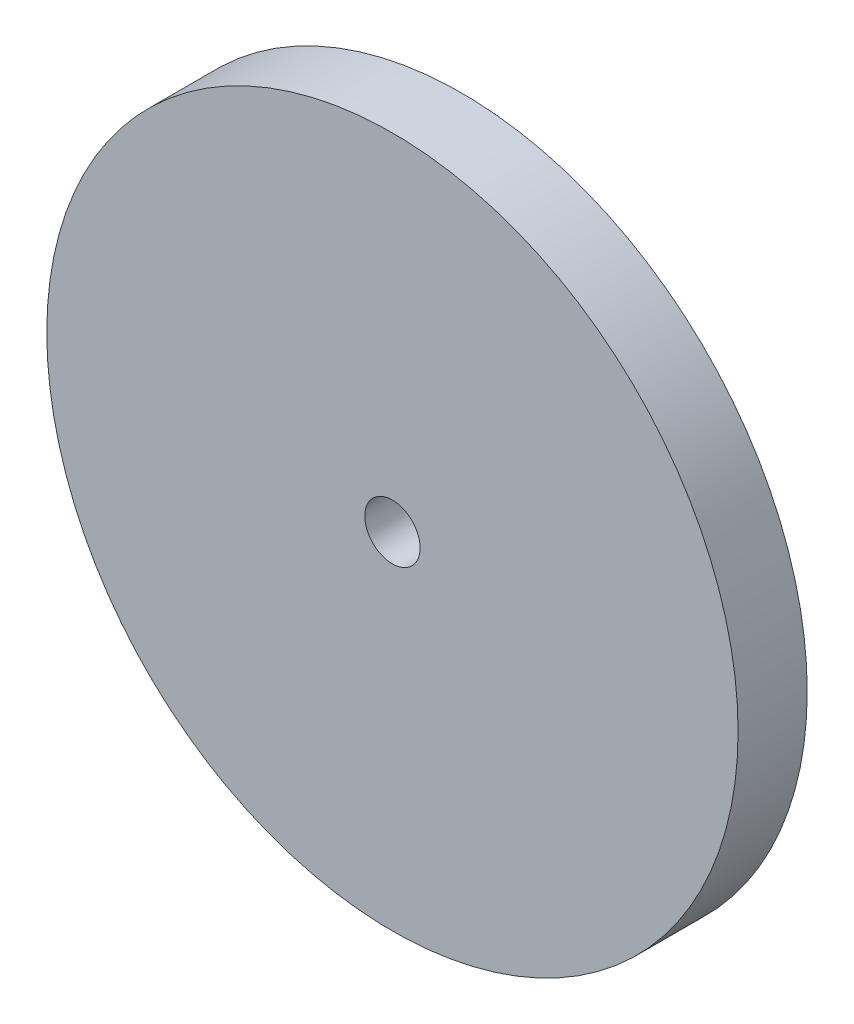
ISO-10303-21;
HEADER;
FILE_DESCRIPTION(('STEP AP214'),'2;1');
FILE_NAME('part.step','',(''),(''),'','','');
FILE_SCHEMA(('AUTOMOTIVE_DESIGN { 1 0 10303 214 1 1 1 1 }'));
ENDSEC;
DATA;
#1=APPLICATION_CONTEXT('core data for automotive mechanical design processes');
#2=APPLICATION_PROTOCOL_DEFINITION('international standard','automotive_design',2000,#1);
#3=PRODUCT_CONTEXT('',#1,'mechanical');
#4=PRODUCT('Part','Part','',(#3));
#5=PRODUCT_RELATED_PRODUCT_CATEGORY('part','',(#4));
#6=PRODUCT_DEFINITION_FORMATION('','',#4);
#7=PRODUCT_DEFINITION_CONTEXT('part definition',#1,'design');
#8=PRODUCT_DEFINITION('design','',#6,#7);
#9=PRODUCT_DEFINITION_SHAPE('','',#8);
#10=(LENGTH_UNIT() NAMED_UNIT(*) SI_UNIT(.MILLI.,.METRE.));
#11=(NAMED_UNIT(*) PLANE_ANGLE_UNIT() SI_UNIT($,.RADIAN.));
#12=(NAMED_UNIT(*) SI_UNIT($,.STERADIAN.) SOLID_ANGLE_UNIT());
#13=UNCERTAINTY_MEASURE_WITH_UNIT(LENGTH_MEASURE(1.E-05),#10,'distance_accuracy_value','');
#14=(GEOMETRIC_REPRESENTATION_CONTEXT(3) GLOBAL_UNCERTAINTY_ASSIGNED_CONTEXT((#13)) GLOBAL_UNIT_ASSIGNED_CONTEXT((#10,
#11,#12)) REPRESENTATION_CONTEXT('',''));
#15=CARTESIAN_POINT('',(0.,0.,0.));
#16=DIRECTION('',(0.,0.,1.));
#17=DIRECTION('',(1.,0.,0.));
#18=AXIS2_PLACEMENT_3D('',#15,#16,#17);
#19=CARTESIAN_POINT('',(0.,0.,10.));
#20=DIRECTION('',(0.,0.,1.));
#21=DIRECTION('',(1.,0.,0.));
#22=AXIS2_PLACEMENT_3D('',#19,#20,#21);
#23=PLANE('',#22);
#24=CARTESIAN_POINT('',(0.,0.,10.));
#25=DIRECTION('',(0.,0.,1.));
#26=DIRECTION('',(1.,0.,0.));
#27=AXIS2_PLACEMENT_3D('',#24,#25,#26);
#28=CIRCLE('',#27,50.);
#29=CARTESIAN_POINT('',(50.,0.,10.));
#30=VERTEX_POINT('',#29);
#31=EDGE_CURVE('E10',#30,#30,#28,.T.);
#32=ORIENTED_EDGE('',*,*,#31,.T.);
#33=EDGE_LOOP('',(#32));
#34=FACE_BOUND('',#33,.T.);
#35=CARTESIAN_POINT('',(0.,0.,10.));
#36=DIRECTION('',(0.,0.,1.));
#37=DIRECTION('',(1.,0.,0.));
#38=AXIS2_PLACEMENT_3D('',#35,#36,#37);
#39=CIRCLE('',#38,4.);
#40=CARTESIAN_POINT('',(4.,0.,10.));
#41=VERTEX_POINT('',#40);
#42=EDGE_CURVE('E42',#41,#41,#39,.T.);
#43=ORIENTED_EDGE('',*,*,#42,.F.);
#44=EDGE_LOOP('',(#43));
#45=FACE_BOUND('',#44,.T.);
#46=ADVANCED_FACE('F31',(#34,#45),#23,.T.);
#47=CARTESIAN_POINT('',(0.,0.,0.));
#48=DIRECTION('',(0.,0.,1.));
#49=DIRECTION('',(1.,0.,0.));
#50=AXIS2_PLACEMENT_3D('',#47,#48,#49);
#51=PLANE('',#50);
#52=CARTESIAN_POINT('',(0.,0.,0.));
#53=DIRECTION('',(0.,0.,1.));
#54=DIRECTION('',(1.,0.,0.));
#55=AXIS2_PLACEMENT_3D('',#52,#53,#54);
#56=CIRCLE('',#55,50.);
#57=CARTESIAN_POINT('',(50.,0.,0.));
#58=VERTEX_POINT('',#57);
#59=EDGE_CURVE('E35',#58,#58,#56,.T.);
#60=ORIENTED_EDGE('',*,*,#59,.F.);
#61=EDGE_LOOP('',(#60));
#62=FACE_BOUND('',#61,.T.);
#63=CARTESIAN_POINT('',(0.,0.,0.));
#64=DIRECTION('',(0.,0.,1.));
#65=DIRECTION('',(1.,0.,0.));
#66=AXIS2_PLACEMENT_3D('',#63,#64,#65);
#67=CIRCLE('',#66,4.);
#68=CARTESIAN_POINT('',(4.,0.,0.));
#69=VERTEX_POINT('',#68);
#70=EDGE_CURVE('E44',#69,#69,#67,.T.);
#71=ORIENTED_EDGE('',*,*,#70,.T.);
#72=EDGE_LOOP('',(#71));
#73=FACE_BOUND('',#72,.T.);
#74=ADVANCED_FACE('F54',(#62,#73),#51,.F.);
#75=CARTESIAN_POINT('',(0.,0.,10.));
#76=DIRECTION('',(0.,0.,-1.));
#77=DIRECTION('',(-1.,0.,0.));
#78=AXIS2_PLACEMENT_3D('',#75,#76,#77);
#79=CYLINDRICAL_SURFACE('',#78,50.);
#80=ORIENTED_EDGE('',*,*,#31,.F.);
#81=EDGE_LOOP('',(#80));
#82=FACE_BOUND('',#81,.T.);
#83=ORIENTED_EDGE('',*,*,#59,.T.);
#84=EDGE_LOOP('',(#83));
#85=FACE_BOUND('',#84,.T.);
#86=ADVANCED_FACE('F33',(#82,#85),#79,.T.);
#87=CARTESIAN_POINT('',(0.,0.,10.));
#88=DIRECTION('',(0.,0.,-1.));
#89=DIRECTION('',(-1.,0.,0.));
#90=AXIS2_PLACEMENT_3D('',#87,#88,#89);
#91=CYLINDRICAL_SURFACE('',#90,4.);
#92=ORIENTED_EDGE('',*,*,#42,.T.);
#93=EDGE_LOOP('',(#92));
#94=FACE_BOUND('',#93,.T.);
#95=ORIENTED_EDGE('',*,*,#70,.F.);
#96=EDGE_LOOP('',(#95));
#97=FACE_BOUND('',#96,.T.);
#98=ADVANCED_FACE('F50',(#94,#97),#91,.F.);
#99=CLOSED_SHELL('',(#46,#74,#86,#98));
#100=MANIFOLD_SOLID_BREP('B2',#99);
#101=ADVANCED_BREP_SHAPE_REPRESENTATION('',(#18,#100),#14);
#102=SHAPE_DEFINITION_REPRESENTATION(#9,#101);
ENDSEC;
END-ISO-10303-21;
